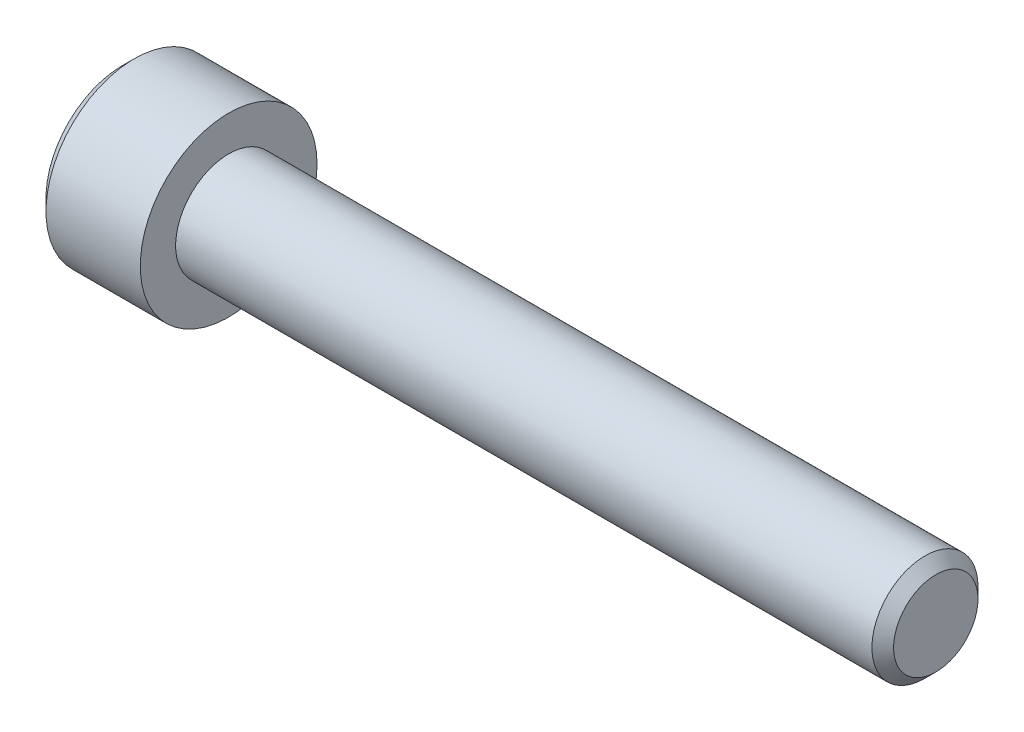
ISO-10303-21;
HEADER;
FILE_DESCRIPTION(('STEP AP214'),'2;1');
FILE_NAME('part.step','',(''),(''),'','','');
FILE_SCHEMA(('AUTOMOTIVE_DESIGN { 1 0 10303 214 1 1 1 1 }'));
ENDSEC;
DATA;
#1=APPLICATION_CONTEXT('core data for automotive mechanical design processes');
#2=APPLICATION_PROTOCOL_DEFINITION('international standard','automotive_design',2000,#1);
#3=PRODUCT_CONTEXT('',#1,'mechanical');
#4=PRODUCT('Part','Part','',(#3));
#5=PRODUCT_RELATED_PRODUCT_CATEGORY('part','',(#4));
#6=PRODUCT_DEFINITION_FORMATION('','',#4);
#7=PRODUCT_DEFINITION_CONTEXT('part definition',#1,'design');
#8=PRODUCT_DEFINITION('design','',#6,#7);
#9=PRODUCT_DEFINITION_SHAPE('','',#8);
#10=(LENGTH_UNIT() NAMED_UNIT(*) SI_UNIT(.MILLI.,.METRE.));
#11=(NAMED_UNIT(*) PLANE_ANGLE_UNIT() SI_UNIT($,.RADIAN.));
#12=(NAMED_UNIT(*) SI_UNIT($,.STERADIAN.) SOLID_ANGLE_UNIT());
#13=UNCERTAINTY_MEASURE_WITH_UNIT(LENGTH_MEASURE(1.E-05),#10,'distance_accuracy_value','');
#14=(GEOMETRIC_REPRESENTATION_CONTEXT(3) GLOBAL_UNCERTAINTY_ASSIGNED_CONTEXT((#13)) GLOBAL_UNIT_ASSIGNED_CONTEXT((#10,
#11,#12)) REPRESENTATION_CONTEXT('',''));
#15=CARTESIAN_POINT('',(0.,0.,0.));
#16=DIRECTION('',(0.,0.,1.));
#17=DIRECTION('',(1.,0.,0.));
#18=AXIS2_PLACEMENT_3D('',#15,#16,#17);
#19=CARTESIAN_POINT('',(-6.,0.,0.));
#20=DIRECTION('',(1.,0.,0.));
#21=DIRECTION('',(0.,0.,-1.));
#22=AXIS2_PLACEMENT_3D('',#19,#20,#21);
#23=PLANE('',#22);
#24=CARTESIAN_POINT('',(-6.,0.,0.));
#25=DIRECTION('',(1.,0.,0.));
#26=DIRECTION('',(0.,0.,-1.));
#27=AXIS2_PLACEMENT_3D('',#24,#25,#26);
#28=CIRCLE('',#27,4.33333333333333);
#29=CARTESIAN_POINT('',(-6.,0.,-4.33333333333333));
#30=VERTEX_POINT('',#29);
#31=EDGE_CURVE('E11',#30,#30,#28,.T.);
#32=ORIENTED_EDGE('',*,*,#31,.F.);
#33=EDGE_LOOP('',(#32));
#34=FACE_BOUND('',#33,.T.);
#35=DIRECTION('',(0.,0.5,-0.866025403784439));
#36=VECTOR('',#35,1.);
#37=CARTESIAN_POINT('',(-6.,-2.88675134594813,0.));
#38=LINE('',#37,#36);
#39=CARTESIAN_POINT('',(-6.,-2.88675134594813,0.));
#40=VERTEX_POINT('',#39);
#41=CARTESIAN_POINT('',(-6.,-1.44337567297406,-2.5));
#42=VERTEX_POINT('',#41);
#43=EDGE_CURVE('E153',#40,#42,#38,.T.);
#44=ORIENTED_EDGE('',*,*,#43,.T.);
#45=DIRECTION('',(0.,1.,0.));
#46=VECTOR('',#45,1.);
#47=CARTESIAN_POINT('',(-6.,-1.44337567297406,-2.5));
#48=LINE('',#47,#46);
#49=CARTESIAN_POINT('',(-6.,1.44337567297406,-2.5));
#50=VERTEX_POINT('',#49);
#51=EDGE_CURVE('E155',#42,#50,#48,.T.);
#52=ORIENTED_EDGE('',*,*,#51,.T.);
#53=DIRECTION('',(0.,0.5,0.866025403784439));
#54=VECTOR('',#53,1.);
#55=CARTESIAN_POINT('',(-6.,1.44337567297406,-2.5));
#56=LINE('',#55,#54);
#57=CARTESIAN_POINT('',(-6.,2.88675134594813,0.));
#58=VERTEX_POINT('',#57);
#59=EDGE_CURVE('E158',#50,#58,#56,.T.);
#60=ORIENTED_EDGE('',*,*,#59,.T.);
#61=DIRECTION('',(0.,-0.5,0.866025403784439));
#62=VECTOR('',#61,1.);
#63=CARTESIAN_POINT('',(-6.,2.88675134594813,0.));
#64=LINE('',#63,#62);
#65=CARTESIAN_POINT('',(-6.,1.44337567297406,2.5));
#66=VERTEX_POINT('',#65);
#67=EDGE_CURVE('E100',#58,#66,#64,.T.);
#68=ORIENTED_EDGE('',*,*,#67,.T.);
#69=DIRECTION('',(0.,-1.,0.));
#70=VECTOR('',#69,1.);
#71=CARTESIAN_POINT('',(-6.,1.44337567297406,2.5));
#72=LINE('',#71,#70);
#73=CARTESIAN_POINT('',(-6.,-1.44337567297406,2.5));
#74=VERTEX_POINT('',#73);
#75=EDGE_CURVE('E160',#66,#74,#72,.T.);
#76=ORIENTED_EDGE('',*,*,#75,.T.);
#77=DIRECTION('',(0.,-0.5,-0.866025403784439));
#78=VECTOR('',#77,1.);
#79=CARTESIAN_POINT('',(-6.,-1.44337567297406,2.5));
#80=LINE('',#79,#78);
#81=EDGE_CURVE('E115',#74,#40,#80,.T.);
#82=ORIENTED_EDGE('',*,*,#81,.T.);
#83=EDGE_LOOP('',(#44,#52,#60,#68,#76,#82));
#84=FACE_BOUND('',#83,.T.);
#85=ADVANCED_FACE('F17',(#34,#84),#23,.F.);
#86=CARTESIAN_POINT('',(-6.,0.,0.));
#87=DIRECTION('',(1.,0.,0.));
#88=DIRECTION('',(0.,0.,-1.));
#89=AXIS2_PLACEMENT_3D('',#86,#87,#88);
#90=CONICAL_SURFACE('',#89,4.33333333333333,0.785398163397452);
#91=CARTESIAN_POINT('',(-5.33333333333334,0.,0.));
#92=DIRECTION('',(1.,0.,0.));
#93=DIRECTION('',(0.,0.,-1.));
#94=AXIS2_PLACEMENT_3D('',#91,#92,#93);
#95=CIRCLE('',#94,5.);
#96=CARTESIAN_POINT('',(-5.33333333333334,0.,-5.));
#97=VERTEX_POINT('',#96);
#98=EDGE_CURVE('E24',#97,#97,#95,.T.);
#99=ORIENTED_EDGE('',*,*,#98,.F.);
#100=EDGE_LOOP('',(#99));
#101=FACE_BOUND('',#100,.T.);
#102=ORIENTED_EDGE('',*,*,#31,.T.);
#103=EDGE_LOOP('',(#102));
#104=FACE_BOUND('',#103,.T.);
#105=ADVANCED_FACE('F144',(#101,#104),#90,.T.);
#106=CARTESIAN_POINT('',(40.,0.,0.));
#107=DIRECTION('',(1.,0.,0.));
#108=DIRECTION('',(0.,0.,-1.));
#109=AXIS2_PLACEMENT_3D('',#106,#107,#108);
#110=CYLINDRICAL_SURFACE('',#109,5.);
#111=CARTESIAN_POINT('',(0.,0.,0.));
#112=DIRECTION('',(1.,0.,0.));
#113=DIRECTION('',(0.,0.,-1.));
#114=AXIS2_PLACEMENT_3D('',#111,#112,#113);
#115=CIRCLE('',#114,5.);
#116=CARTESIAN_POINT('',(0.,0.,-5.));
#117=VERTEX_POINT('',#116);
#118=EDGE_CURVE('E137',#117,#117,#115,.T.);
#119=ORIENTED_EDGE('',*,*,#118,.F.);
#120=EDGE_LOOP('',(#119));
#121=FACE_BOUND('',#120,.T.);
#122=ORIENTED_EDGE('',*,*,#98,.T.);
#123=EDGE_LOOP('',(#122));
#124=FACE_BOUND('',#123,.T.);
#125=ADVANCED_FACE('F142',(#121,#124),#110,.T.);
#126=CARTESIAN_POINT('',(0.,5.,0.));
#127=DIRECTION('',(-1.,0.,0.));
#128=DIRECTION('',(0.,0.,1.));
#129=AXIS2_PLACEMENT_3D('',#126,#127,#128);
#130=PLANE('',#129);
#131=CARTESIAN_POINT('',(0.,0.,0.));
#132=DIRECTION('',(1.,0.,0.));
#133=DIRECTION('',(0.,0.,-1.));
#134=AXIS2_PLACEMENT_3D('',#131,#132,#133);
#135=CIRCLE('',#134,3.);
#136=CARTESIAN_POINT('',(0.,0.,-3.));
#137=VERTEX_POINT('',#136);
#138=EDGE_CURVE('E134',#137,#137,#135,.T.);
#139=ORIENTED_EDGE('',*,*,#138,.F.);
#140=EDGE_LOOP('',(#139));
#141=FACE_BOUND('',#140,.T.);
#142=ORIENTED_EDGE('',*,*,#118,.T.);
#143=EDGE_LOOP('',(#142));
#144=FACE_BOUND('',#143,.T.);
#145=ADVANCED_FACE('F251',(#141,#144),#130,.F.);
#146=CARTESIAN_POINT('',(40.,0.,0.));
#147=DIRECTION('',(1.,0.,0.));
#148=DIRECTION('',(0.,0.,-1.));
#149=AXIS2_PLACEMENT_3D('',#146,#147,#148);
#150=CYLINDRICAL_SURFACE('',#149,3.);
#151=CARTESIAN_POINT('',(39.3865,0.,0.));
#152=DIRECTION('',(1.,0.,0.));
#153=DIRECTION('',(0.,0.,-1.));
#154=AXIS2_PLACEMENT_3D('',#151,#152,#153);
#155=CIRCLE('',#154,3.);
#156=CARTESIAN_POINT('',(39.3865,0.,-3.));
#157=VERTEX_POINT('',#156);
#158=EDGE_CURVE('E131',#157,#157,#155,.T.);
#159=ORIENTED_EDGE('',*,*,#158,.F.);
#160=EDGE_LOOP('',(#159));
#161=FACE_BOUND('',#160,.T.);
#162=ORIENTED_EDGE('',*,*,#138,.T.);
#163=EDGE_LOOP('',(#162));
#164=FACE_BOUND('',#163,.T.);
#165=ADVANCED_FACE('F247',(#161,#164),#150,.T.);
#166=CARTESIAN_POINT('',(39.3865,0.,0.));
#167=DIRECTION('',(-1.,0.,0.));
#168=DIRECTION('',(0.,0.,1.));
#169=AXIS2_PLACEMENT_3D('',#166,#167,#168);
#170=CONICAL_SURFACE('',#169,3.,0.785398163397446);
#171=CARTESIAN_POINT('',(40.,0.,0.));
#172=DIRECTION('',(1.,0.,0.));
#173=DIRECTION('',(0.,0.,-1.));
#174=AXIS2_PLACEMENT_3D('',#171,#172,#173);
#175=CIRCLE('',#174,2.3865);
#176=CARTESIAN_POINT('',(40.,0.,-2.3865));
#177=VERTEX_POINT('',#176);
#178=EDGE_CURVE('E127',#177,#177,#175,.T.);
#179=ORIENTED_EDGE('',*,*,#178,.F.);
#180=EDGE_LOOP('',(#179));
#181=FACE_BOUND('',#180,.T.);
#182=ORIENTED_EDGE('',*,*,#158,.T.);
#183=EDGE_LOOP('',(#182));
#184=FACE_BOUND('',#183,.T.);
#185=ADVANCED_FACE('F243',(#181,#184),#170,.T.);
#186=CARTESIAN_POINT('',(40.,2.3865,0.));
#187=DIRECTION('',(-1.,0.,0.));
#188=DIRECTION('',(0.,0.,1.));
#189=AXIS2_PLACEMENT_3D('',#186,#187,#188);
#190=PLANE('',#189);
#191=ORIENTED_EDGE('',*,*,#178,.T.);
#192=EDGE_LOOP('',(#191));
#193=FACE_BOUND('',#192,.T.);
#194=ADVANCED_FACE('F238',(#193),#190,.F.);
#195=CARTESIAN_POINT('',(-3.,1.44337567297406,2.5));
#196=DIRECTION('',(0.,0.,-1.));
#197=DIRECTION('',(-1.,0.,0.));
#198=AXIS2_PLACEMENT_3D('',#195,#196,#197);
#199=PLANE('',#198);
#200=ORIENTED_EDGE('',*,*,#75,.F.);
#201=DIRECTION('',(-1.,0.,0.));
#202=VECTOR('',#201,1.);
#203=CARTESIAN_POINT('',(-3.,1.44337567297406,2.5));
#204=LINE('',#203,#202);
#205=CARTESIAN_POINT('',(-3.,1.44337567297406,2.5));
#206=VERTEX_POINT('',#205);
#207=EDGE_CURVE('E167',#206,#66,#204,.T.);
#208=ORIENTED_EDGE('',*,*,#207,.F.);
#209=DIRECTION('',(0.,-1.,0.));
#210=VECTOR('',#209,1.);
#211=CARTESIAN_POINT('',(-3.,1.44337567297406,2.5));
#212=LINE('',#211,#210);
#213=CARTESIAN_POINT('',(-3.,0.,2.5));
#214=VERTEX_POINT('',#213);
#215=EDGE_CURVE('E97',#206,#214,#212,.T.);
#216=ORIENTED_EDGE('',*,*,#215,.T.);
#217=CARTESIAN_POINT('',(-3.,-1.44337567297406,2.5));
#218=VERTEX_POINT('',#217);
#219=EDGE_CURVE('E89',#214,#218,#212,.T.);
#220=ORIENTED_EDGE('',*,*,#219,.T.);
#221=DIRECTION('',(-1.,0.,0.));
#222=VECTOR('',#221,1.);
#223=CARTESIAN_POINT('',(-3.,-1.44337567297406,2.5));
#224=LINE('',#223,#222);
#225=EDGE_CURVE('E93',#218,#74,#224,.T.);
#226=ORIENTED_EDGE('',*,*,#225,.T.);
#227=EDGE_LOOP('',(#200,#208,#216,#220,#226));
#228=FACE_BOUND('',#227,.T.);
#229=ADVANCED_FACE('F91',(#228),#199,.T.);
#230=CARTESIAN_POINT('',(-3.,-1.44337567297406,2.5));
#231=DIRECTION('',(0.,0.866025403784439,-0.5));
#232=DIRECTION('',(0.,0.5,0.866025403784439));
#233=AXIS2_PLACEMENT_3D('',#230,#231,#232);
#234=PLANE('',#233);
#235=ORIENTED_EDGE('',*,*,#81,.F.);
#236=ORIENTED_EDGE('',*,*,#225,.F.);
#237=DIRECTION('',(0.,-0.5,-0.866025403784439));
#238=VECTOR('',#237,1.);
#239=CARTESIAN_POINT('',(-3.,-1.44337567297406,2.5));
#240=LINE('',#239,#238);
#241=CARTESIAN_POINT('',(-3.,-2.1650635094611,1.25));
#242=VERTEX_POINT('',#241);
#243=EDGE_CURVE('E103',#218,#242,#240,.T.);
#244=ORIENTED_EDGE('',*,*,#243,.T.);
#245=CARTESIAN_POINT('',(-3.,-2.88675134594813,0.));
#246=VERTEX_POINT('',#245);
#247=EDGE_CURVE('E110',#242,#246,#240,.T.);
#248=ORIENTED_EDGE('',*,*,#247,.T.);
#249=DIRECTION('',(-1.,0.,0.));
#250=VECTOR('',#249,1.);
#251=CARTESIAN_POINT('',(-3.,-2.88675134594813,0.));
#252=LINE('',#251,#250);
#253=EDGE_CURVE('E117',#246,#40,#252,.T.);
#254=ORIENTED_EDGE('',*,*,#253,.T.);
#255=EDGE_LOOP('',(#235,#236,#244,#248,#254));
#256=FACE_BOUND('',#255,.T.);
#257=ADVANCED_FACE('F112',(#256),#234,.T.);
#258=CARTESIAN_POINT('',(-3.,-2.88675134594813,0.));
#259=DIRECTION('',(0.,0.866025403784439,0.5));
#260=DIRECTION('',(0.,-0.5,0.866025403784439));
#261=AXIS2_PLACEMENT_3D('',#258,#259,#260);
#262=PLANE('',#261);
#263=ORIENTED_EDGE('',*,*,#43,.F.);
#264=ORIENTED_EDGE('',*,*,#253,.F.);
#265=DIRECTION('',(0.,0.5,-0.866025403784439));
#266=VECTOR('',#265,1.);
#267=CARTESIAN_POINT('',(-3.,-2.88675134594813,0.));
#268=LINE('',#267,#266);
#269=CARTESIAN_POINT('',(-3.,-2.1650635094611,-1.25));
#270=VERTEX_POINT('',#269);
#271=EDGE_CURVE('E31',#246,#270,#268,.T.);
#272=ORIENTED_EDGE('',*,*,#271,.T.);
#273=CARTESIAN_POINT('',(-3.,-1.44337567297406,-2.5));
#274=VERTEX_POINT('',#273);
#275=EDGE_CURVE('E109',#270,#274,#268,.T.);
#276=ORIENTED_EDGE('',*,*,#275,.T.);
#277=DIRECTION('',(-1.,0.,0.));
#278=VECTOR('',#277,1.);
#279=CARTESIAN_POINT('',(-3.,-1.44337567297406,-2.5));
#280=LINE('',#279,#278);
#281=EDGE_CURVE('E123',#274,#42,#280,.T.);
#282=ORIENTED_EDGE('',*,*,#281,.T.);
#283=EDGE_LOOP('',(#263,#264,#272,#276,#282));
#284=FACE_BOUND('',#283,.T.);
#285=ADVANCED_FACE('F177',(#284),#262,.T.);
#286=CARTESIAN_POINT('',(-3.,-1.44337567297406,-2.5));
#287=DIRECTION('',(0.,0.,1.));
#288=DIRECTION('',(1.,0.,0.));
#289=AXIS2_PLACEMENT_3D('',#286,#287,#288);
#290=PLANE('',#289);
#291=ORIENTED_EDGE('',*,*,#51,.F.);
#292=ORIENTED_EDGE('',*,*,#281,.F.);
#293=DIRECTION('',(0.,1.,0.));
#294=VECTOR('',#293,1.);
#295=CARTESIAN_POINT('',(-3.,-1.44337567297406,-2.5));
#296=LINE('',#295,#294);
#297=CARTESIAN_POINT('',(-3.,0.,-2.5));
#298=VERTEX_POINT('',#297);
#299=EDGE_CURVE('E182',#274,#298,#296,.T.);
#300=ORIENTED_EDGE('',*,*,#299,.T.);
#301=CARTESIAN_POINT('',(-3.,1.44337567297406,-2.5));
#302=VERTEX_POINT('',#301);
#303=EDGE_CURVE('E190',#298,#302,#296,.T.);
#304=ORIENTED_EDGE('',*,*,#303,.T.);
#305=DIRECTION('',(-1.,0.,0.));
#306=VECTOR('',#305,1.);
#307=CARTESIAN_POINT('',(-3.,1.44337567297406,-2.5));
#308=LINE('',#307,#306);
#309=EDGE_CURVE('E174',#302,#50,#308,.T.);
#310=ORIENTED_EDGE('',*,*,#309,.T.);
#311=EDGE_LOOP('',(#291,#292,#300,#304,#310));
#312=FACE_BOUND('',#311,.T.);
#313=ADVANCED_FACE('F181',(#312),#290,.T.);
#314=CARTESIAN_POINT('',(-3.,1.44337567297406,-2.5));
#315=DIRECTION('',(0.,-0.866025403784439,0.5));
#316=DIRECTION('',(0.,-0.5,-0.866025403784439));
#317=AXIS2_PLACEMENT_3D('',#314,#315,#316);
#318=PLANE('',#317);
#319=ORIENTED_EDGE('',*,*,#59,.F.);
#320=ORIENTED_EDGE('',*,*,#309,.F.);
#321=DIRECTION('',(0.,0.5,0.866025403784439));
#322=VECTOR('',#321,1.);
#323=CARTESIAN_POINT('',(-3.,1.44337567297406,-2.5));
#324=LINE('',#323,#322);
#325=CARTESIAN_POINT('',(-3.,2.1650635094611,-1.25));
#326=VERTEX_POINT('',#325);
#327=EDGE_CURVE('E192',#302,#326,#324,.T.);
#328=ORIENTED_EDGE('',*,*,#327,.T.);
#329=CARTESIAN_POINT('',(-3.,2.88675134594813,0.));
#330=VERTEX_POINT('',#329);
#331=EDGE_CURVE('E189',#326,#330,#324,.T.);
#332=ORIENTED_EDGE('',*,*,#331,.T.);
#333=DIRECTION('',(-1.,0.,0.));
#334=VECTOR('',#333,1.);
#335=CARTESIAN_POINT('',(-3.,2.88675134594813,0.));
#336=LINE('',#335,#334);
#337=EDGE_CURVE('E170',#330,#58,#336,.T.);
#338=ORIENTED_EDGE('',*,*,#337,.T.);
#339=EDGE_LOOP('',(#319,#320,#328,#332,#338));
#340=FACE_BOUND('',#339,.T.);
#341=ADVANCED_FACE('F220',(#340),#318,.T.);
#342=CARTESIAN_POINT('',(-3.,2.88675134594813,0.));
#343=DIRECTION('',(0.,-0.866025403784439,-0.5));
#344=DIRECTION('',(0.,0.5,-0.866025403784439));
#345=AXIS2_PLACEMENT_3D('',#342,#343,#344);
#346=PLANE('',#345);
#347=ORIENTED_EDGE('',*,*,#67,.F.);
#348=ORIENTED_EDGE('',*,*,#337,.F.);
#349=DIRECTION('',(0.,-0.5,0.866025403784439));
#350=VECTOR('',#349,1.);
#351=CARTESIAN_POINT('',(-3.,2.88675134594813,0.));
#352=LINE('',#351,#350);
#353=CARTESIAN_POINT('',(-3.,2.1650635094611,1.25));
#354=VERTEX_POINT('',#353);
#355=EDGE_CURVE('E171',#330,#354,#352,.T.);
#356=ORIENTED_EDGE('',*,*,#355,.T.);
#357=EDGE_CURVE('E197',#354,#206,#352,.T.);
#358=ORIENTED_EDGE('',*,*,#357,.T.);
#359=ORIENTED_EDGE('',*,*,#207,.T.);
#360=EDGE_LOOP('',(#347,#348,#356,#358,#359));
#361=FACE_BOUND('',#360,.T.);
#362=ADVANCED_FACE('F200',(#361),#346,.T.);
#363=CARTESIAN_POINT('',(-3.,0.,0.));
#364=DIRECTION('',(1.,0.,0.));
#365=DIRECTION('',(0.,0.,-1.));
#366=AXIS2_PLACEMENT_3D('',#363,#364,#365);
#367=PLANE('',#366);
#368=CARTESIAN_POINT('',(-3.,0.,0.));
#369=DIRECTION('',(1.,0.,0.));
#370=DIRECTION('',(0.,0.,-1.));
#371=AXIS2_PLACEMENT_3D('',#368,#369,#370);
#372=CIRCLE('',#371,2.5);
#373=EDGE_CURVE('E116',#298,#326,#372,.T.);
#374=ORIENTED_EDGE('',*,*,#373,.T.);
#375=ORIENTED_EDGE('',*,*,#327,.F.);
#376=ORIENTED_EDGE('',*,*,#303,.F.);
#377=EDGE_LOOP('',(#374,#375,#376));
#378=FACE_BOUND('',#377,.T.);
#379=ADVANCED_FACE('F215',(#378),#367,.F.);
#380=ORIENTED_EDGE('',*,*,#331,.F.);
#381=EDGE_CURVE('E122',#326,#354,#372,.T.);
#382=ORIENTED_EDGE('',*,*,#381,.T.);
#383=ORIENTED_EDGE('',*,*,#355,.F.);
#384=EDGE_LOOP('',(#380,#382,#383));
#385=FACE_BOUND('',#384,.T.);
#386=ADVANCED_FACE('F217',(#385),#367,.F.);
#387=EDGE_CURVE('E128',#354,#214,#372,.T.);
#388=ORIENTED_EDGE('',*,*,#387,.T.);
#389=ORIENTED_EDGE('',*,*,#215,.F.);
#390=ORIENTED_EDGE('',*,*,#357,.F.);
#391=EDGE_LOOP('',(#388,#389,#390));
#392=FACE_BOUND('',#391,.T.);
#393=ADVANCED_FACE('F206',(#392),#367,.F.);
#394=EDGE_CURVE('E105',#214,#242,#372,.T.);
#395=ORIENTED_EDGE('',*,*,#394,.T.);
#396=ORIENTED_EDGE('',*,*,#243,.F.);
#397=ORIENTED_EDGE('',*,*,#219,.F.);
#398=EDGE_LOOP('',(#395,#396,#397));
#399=FACE_BOUND('',#398,.T.);
#400=ADVANCED_FACE('F104',(#399),#367,.F.);
#401=EDGE_CURVE('E209',#242,#270,#372,.T.);
#402=ORIENTED_EDGE('',*,*,#401,.T.);
#403=ORIENTED_EDGE('',*,*,#271,.F.);
#404=ORIENTED_EDGE('',*,*,#247,.F.);
#405=EDGE_LOOP('',(#402,#403,#404));
#406=FACE_BOUND('',#405,.T.);
#407=ADVANCED_FACE('F208',(#406),#367,.F.);
#408=EDGE_CURVE('E120',#270,#298,#372,.T.);
#409=ORIENTED_EDGE('',*,*,#408,.T.);
#410=ORIENTED_EDGE('',*,*,#299,.F.);
#411=ORIENTED_EDGE('',*,*,#275,.F.);
#412=EDGE_LOOP('',(#409,#410,#411));
#413=FACE_BOUND('',#412,.T.);
#414=ADVANCED_FACE('F185',(#413),#367,.F.);
#415=CARTESIAN_POINT('',(-3.,0.,0.));
#416=DIRECTION('',(-1.,0.,0.));
#417=DIRECTION('',(0.,0.,1.));
#418=AXIS2_PLACEMENT_3D('',#415,#416,#417);
#419=CONICAL_SURFACE('',#418,2.5,1.30899693899575);
#420=CARTESIAN_POINT('',(-2.33012701892219,0.,0.));
#421=VERTEX_POINT('',#420);
#422=VERTEX_LOOP('',#421);
#423=FACE_BOUND('',#422,.T.);
#424=ORIENTED_EDGE('',*,*,#381,.F.);
#425=ORIENTED_EDGE('',*,*,#373,.F.);
#426=ORIENTED_EDGE('',*,*,#408,.F.);
#427=ORIENTED_EDGE('',*,*,#401,.F.);
#428=ORIENTED_EDGE('',*,*,#394,.F.);
#429=ORIENTED_EDGE('',*,*,#387,.F.);
#430=EDGE_LOOP('',(#424,#425,#426,#427,#428,#429));
#431=FACE_BOUND('',#430,.T.);
#432=ADVANCED_FACE('F211',(#423,#431),#419,.F.);
#433=CLOSED_SHELL('',(#85,#105,#125,#145,#165,#185,#194,#229,#257,#285,#313,#341,#362,#379,#386,
#393,#400,#407,#414,#432));
#434=MANIFOLD_SOLID_BREP('B1',#433);
#435=ADVANCED_BREP_SHAPE_REPRESENTATION('',(#18,#434),#14);
#436=SHAPE_DEFINITION_REPRESENTATION(#9,#435);
ENDSEC;
END-ISO-10303-21;
